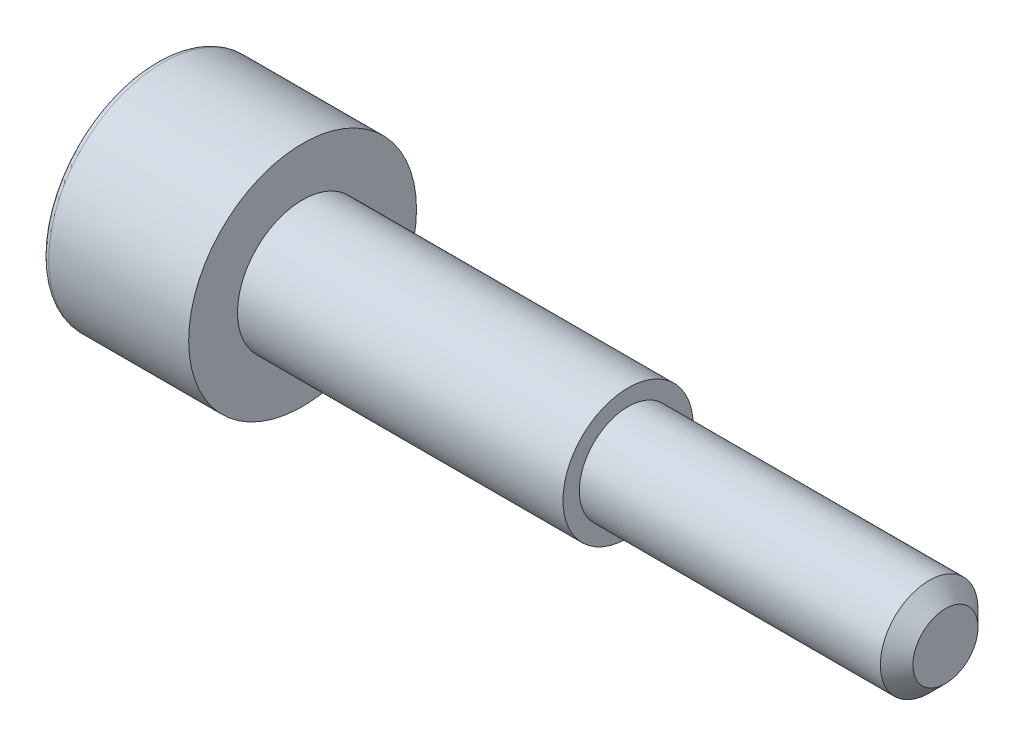
ISO-10303-21;
HEADER;
FILE_DESCRIPTION(('STEP AP214'),'2;1');
FILE_NAME('part.step','',(''),(''),'','','');
FILE_SCHEMA(('AUTOMOTIVE_DESIGN { 1 0 10303 214 1 1 1 1 }'));
ENDSEC;
DATA;
#1=APPLICATION_CONTEXT('core data for automotive mechanical design processes');
#2=APPLICATION_PROTOCOL_DEFINITION('international standard','automotive_design',2000,#1);
#3=PRODUCT_CONTEXT('',#1,'mechanical');
#4=PRODUCT('Part','Part','',(#3));
#5=PRODUCT_RELATED_PRODUCT_CATEGORY('part','',(#4));
#6=PRODUCT_DEFINITION_FORMATION('','',#4);
#7=PRODUCT_DEFINITION_CONTEXT('part definition',#1,'design');
#8=PRODUCT_DEFINITION('design','',#6,#7);
#9=PRODUCT_DEFINITION_SHAPE('','',#8);
#10=(LENGTH_UNIT() NAMED_UNIT(*) SI_UNIT(.MILLI.,.METRE.));
#11=(NAMED_UNIT(*) PLANE_ANGLE_UNIT() SI_UNIT($,.RADIAN.));
#12=(NAMED_UNIT(*) SI_UNIT($,.STERADIAN.) SOLID_ANGLE_UNIT());
#13=UNCERTAINTY_MEASURE_WITH_UNIT(LENGTH_MEASURE(1.E-05),#10,'distance_accuracy_value','');
#14=(GEOMETRIC_REPRESENTATION_CONTEXT(3) GLOBAL_UNCERTAINTY_ASSIGNED_CONTEXT((#13)) GLOBAL_UNIT_ASSIGNED_CONTEXT((#10,
#11,#12)) REPRESENTATION_CONTEXT('',''));
#15=CARTESIAN_POINT('',(0.,0.,0.));
#16=DIRECTION('',(0.,0.,1.));
#17=DIRECTION('',(1.,0.,0.));
#18=AXIS2_PLACEMENT_3D('',#15,#16,#17);
#19=CARTESIAN_POINT('',(0.,0.,0.));
#20=DIRECTION('',(1.,0.,0.));
#21=DIRECTION('',(0.,0.,-1.));
#22=AXIS2_PLACEMENT_3D('',#19,#20,#21);
#23=PLANE('',#22);
#24=CARTESIAN_POINT('',(0.,0.,0.));
#25=DIRECTION('',(1.,0.,0.));
#26=DIRECTION('',(0.,0.,-1.));
#27=AXIS2_PLACEMENT_3D('',#24,#25,#26);
#28=CIRCLE('',#27,3.3);
#29=CARTESIAN_POINT('',(0.,0.,-3.3));
#30=VERTEX_POINT('',#29);
#31=EDGE_CURVE('E11',#30,#30,#28,.F.);
#32=ORIENTED_EDGE('',*,*,#31,.T.);
#33=EDGE_LOOP('',(#32));
#34=FACE_BOUND('',#33,.T.);
#35=DIRECTION('',(0.,0.866025403784439,-0.5));
#36=VECTOR('',#35,1.);
#37=CARTESIAN_POINT('',(0.,-1.5,-0.86602540378444));
#38=LINE('',#37,#36);
#39=CARTESIAN_POINT('',(0.,-1.5,-0.86602540378444));
#40=VERTEX_POINT('',#39);
#41=CARTESIAN_POINT('',(0.,0.,-1.73205080756888));
#42=VERTEX_POINT('',#41);
#43=EDGE_CURVE('E52',#40,#42,#38,.T.);
#44=ORIENTED_EDGE('',*,*,#43,.T.);
#45=DIRECTION('',(0.,0.866025403784438,0.5));
#46=VECTOR('',#45,1.);
#47=CARTESIAN_POINT('',(0.,0.,-1.73205080756888));
#48=LINE('',#47,#46);
#49=CARTESIAN_POINT('',(0.,1.5,-0.866025403784438));
#50=VERTEX_POINT('',#49);
#51=EDGE_CURVE('E111',#42,#50,#48,.T.);
#52=ORIENTED_EDGE('',*,*,#51,.T.);
#53=DIRECTION('',(0.,0.,1.));
#54=VECTOR('',#53,1.);
#55=CARTESIAN_POINT('',(0.,1.5,-0.866025403784438));
#56=LINE('',#55,#54);
#57=CARTESIAN_POINT('',(0.,1.5,0.866025403784439));
#58=VERTEX_POINT('',#57);
#59=EDGE_CURVE('E109',#50,#58,#56,.T.);
#60=ORIENTED_EDGE('',*,*,#59,.T.);
#61=DIRECTION('',(0.,-0.866025403784439,0.5));
#62=VECTOR('',#61,1.);
#63=CARTESIAN_POINT('',(0.,1.5,0.866025403784439));
#64=LINE('',#63,#62);
#65=CARTESIAN_POINT('',(0.,0.,1.73205080756888));
#66=VERTEX_POINT('',#65);
#67=EDGE_CURVE('E88',#58,#66,#64,.T.);
#68=ORIENTED_EDGE('',*,*,#67,.T.);
#69=DIRECTION('',(0.,-0.866025403784438,-0.5));
#70=VECTOR('',#69,1.);
#71=CARTESIAN_POINT('',(0.,0.,1.73205080756888));
#72=LINE('',#71,#70);
#73=CARTESIAN_POINT('',(0.,-1.5,0.866025403784439));
#74=VERTEX_POINT('',#73);
#75=EDGE_CURVE('E99',#66,#74,#72,.T.);
#76=ORIENTED_EDGE('',*,*,#75,.T.);
#77=DIRECTION('',(0.,0.,-1.));
#78=VECTOR('',#77,1.);
#79=CARTESIAN_POINT('',(0.,-1.5,0.866025403784439));
#80=LINE('',#79,#78);
#81=EDGE_CURVE('E105',#74,#40,#80,.T.);
#82=ORIENTED_EDGE('',*,*,#81,.T.);
#83=EDGE_LOOP('',(#44,#52,#60,#68,#76,#82));
#84=FACE_BOUND('',#83,.T.);
#85=ADVANCED_FACE('F37',(#34,#84),#23,.F.);
#86=CARTESIAN_POINT('',(14.5,0.,0.));
#87=DIRECTION('',(1.,0.,0.));
#88=DIRECTION('',(0.,0.,-1.));
#89=AXIS2_PLACEMENT_3D('',#86,#87,#88);
#90=PLANE('',#89);
#91=CARTESIAN_POINT('',(14.5,0.,0.));
#92=DIRECTION('',(1.,0.,0.));
#93=DIRECTION('',(0.,0.,-1.));
#94=AXIS2_PLACEMENT_3D('',#91,#92,#93);
#95=CIRCLE('',#94,2.);
#96=CARTESIAN_POINT('',(14.5,0.,-2.));
#97=VERTEX_POINT('',#96);
#98=EDGE_CURVE('E130',#97,#97,#95,.T.);
#99=ORIENTED_EDGE('',*,*,#98,.T.);
#100=EDGE_LOOP('',(#99));
#101=FACE_BOUND('',#100,.T.);
#102=CARTESIAN_POINT('',(14.5,0.,0.));
#103=DIRECTION('',(1.,0.,0.));
#104=DIRECTION('',(0.,0.,-1.));
#105=AXIS2_PLACEMENT_3D('',#102,#103,#104);
#106=CIRCLE('',#105,1.5);
#107=CARTESIAN_POINT('',(14.5,0.,-1.5));
#108=VERTEX_POINT('',#107);
#109=EDGE_CURVE('E126',#108,#108,#106,.T.);
#110=ORIENTED_EDGE('',*,*,#109,.F.);
#111=EDGE_LOOP('',(#110));
#112=FACE_BOUND('',#111,.T.);
#113=ADVANCED_FACE('F160',(#101,#112),#90,.T.);
#114=CARTESIAN_POINT('',(4.5,0.,0.));
#115=DIRECTION('',(1.,0.,0.));
#116=DIRECTION('',(0.,0.,-1.));
#117=AXIS2_PLACEMENT_3D('',#114,#115,#116);
#118=PLANE('',#117);
#119=CARTESIAN_POINT('',(4.5,0.,0.));
#120=DIRECTION('',(1.,0.,0.));
#121=DIRECTION('',(0.,0.,-1.));
#122=AXIS2_PLACEMENT_3D('',#119,#120,#121);
#123=CIRCLE('',#122,3.5);
#124=CARTESIAN_POINT('',(4.5,0.,-3.5));
#125=VERTEX_POINT('',#124);
#126=EDGE_CURVE('E133',#125,#125,#123,.T.);
#127=ORIENTED_EDGE('',*,*,#126,.T.);
#128=EDGE_LOOP('',(#127));
#129=FACE_BOUND('',#128,.T.);
#130=CARTESIAN_POINT('',(4.5,0.,0.));
#131=DIRECTION('',(1.,0.,0.));
#132=DIRECTION('',(0.,0.,-1.));
#133=AXIS2_PLACEMENT_3D('',#130,#131,#132);
#134=CIRCLE('',#133,2.);
#135=CARTESIAN_POINT('',(4.5,0.,-2.));
#136=VERTEX_POINT('',#135);
#137=EDGE_CURVE('E129',#136,#136,#134,.T.);
#138=ORIENTED_EDGE('',*,*,#137,.F.);
#139=EDGE_LOOP('',(#138));
#140=FACE_BOUND('',#139,.T.);
#141=ADVANCED_FACE('F166',(#129,#140),#118,.T.);
#142=CARTESIAN_POINT('',(4.5,0.,0.));
#143=DIRECTION('',(-1.,0.,0.));
#144=DIRECTION('',(0.,0.,1.));
#145=AXIS2_PLACEMENT_3D('',#142,#143,#144);
#146=CYLINDRICAL_SURFACE('',#145,3.5);
#147=CARTESIAN_POINT('',(0.2,0.,0.));
#148=DIRECTION('',(1.,0.,0.));
#149=DIRECTION('',(0.,0.,-1.));
#150=AXIS2_PLACEMENT_3D('',#147,#148,#149);
#151=CIRCLE('',#150,3.5);
#152=CARTESIAN_POINT('',(0.2,0.,-3.5));
#153=VERTEX_POINT('',#152);
#154=EDGE_CURVE('E45',#153,#153,#151,.T.);
#155=ORIENTED_EDGE('',*,*,#154,.T.);
#156=EDGE_LOOP('',(#155));
#157=FACE_BOUND('',#156,.T.);
#158=ORIENTED_EDGE('',*,*,#126,.F.);
#159=EDGE_LOOP('',(#158));
#160=FACE_BOUND('',#159,.T.);
#161=ADVANCED_FACE('F147',(#157,#160),#146,.T.);
#162=CARTESIAN_POINT('',(14.5,0.,0.));
#163=DIRECTION('',(-1.,0.,0.));
#164=DIRECTION('',(0.,0.,1.));
#165=AXIS2_PLACEMENT_3D('',#162,#163,#164);
#166=CYLINDRICAL_SURFACE('',#165,2.);
#167=ORIENTED_EDGE('',*,*,#98,.F.);
#168=EDGE_LOOP('',(#167));
#169=FACE_BOUND('',#168,.T.);
#170=ORIENTED_EDGE('',*,*,#137,.T.);
#171=EDGE_LOOP('',(#170));
#172=FACE_BOUND('',#171,.T.);
#173=ADVANCED_FACE('F173',(#169,#172),#166,.T.);
#174=CARTESIAN_POINT('',(24.25,0.,0.));
#175=DIRECTION('',(-1.,0.,0.));
#176=DIRECTION('',(0.,0.,1.));
#177=AXIS2_PLACEMENT_3D('',#174,#175,#176);
#178=CYLINDRICAL_SURFACE('',#177,1.5);
#179=CARTESIAN_POINT('',(23.75,0.,0.));
#180=DIRECTION('',(1.,0.,0.));
#181=DIRECTION('',(0.,0.,-1.));
#182=AXIS2_PLACEMENT_3D('',#179,#180,#181);
#183=CIRCLE('',#182,1.5);
#184=CARTESIAN_POINT('',(23.75,0.,-1.5));
#185=VERTEX_POINT('',#184);
#186=EDGE_CURVE('E142',#185,#185,#183,.F.);
#187=ORIENTED_EDGE('',*,*,#186,.T.);
#188=EDGE_LOOP('',(#187));
#189=FACE_BOUND('',#188,.T.);
#190=ORIENTED_EDGE('',*,*,#109,.T.);
#191=EDGE_LOOP('',(#190));
#192=FACE_BOUND('',#191,.T.);
#193=ADVANCED_FACE('F178',(#189,#192),#178,.T.);
#194=CARTESIAN_POINT('',(24.25,0.,0.));
#195=DIRECTION('',(1.,0.,0.));
#196=DIRECTION('',(0.,0.,-1.));
#197=AXIS2_PLACEMENT_3D('',#194,#195,#196);
#198=PLANE('',#197);
#199=CARTESIAN_POINT('',(24.25,0.,0.));
#200=DIRECTION('',(1.,0.,0.));
#201=DIRECTION('',(0.,0.,-1.));
#202=AXIS2_PLACEMENT_3D('',#199,#200,#201);
#203=CIRCLE('',#202,0.999999999999997);
#204=CARTESIAN_POINT('',(24.25,0.,-0.999999999999997));
#205=VERTEX_POINT('',#204);
#206=EDGE_CURVE('E139',#205,#205,#203,.T.);
#207=ORIENTED_EDGE('',*,*,#206,.T.);
#208=EDGE_LOOP('',(#207));
#209=FACE_BOUND('',#208,.T.);
#210=ADVANCED_FACE('F206',(#209),#198,.T.);
#211=CARTESIAN_POINT('',(2.4,-1.5,-0.86602540378444));
#212=DIRECTION('',(0.,0.5,0.866025403784439));
#213=DIRECTION('',(0.,-0.866025403784439,0.5));
#214=AXIS2_PLACEMENT_3D('',#211,#212,#213);
#215=PLANE('',#214);
#216=ORIENTED_EDGE('',*,*,#43,.F.);
#217=DIRECTION('',(-1.,0.,0.));
#218=VECTOR('',#217,1.);
#219=CARTESIAN_POINT('',(2.4,-1.5,-0.86602540378444));
#220=LINE('',#219,#218);
#221=CARTESIAN_POINT('',(2.4,-1.5,-0.86602540378444));
#222=VERTEX_POINT('',#221);
#223=EDGE_CURVE('E117',#222,#40,#220,.T.);
#224=ORIENTED_EDGE('',*,*,#223,.F.);
#225=DIRECTION('',(0.,0.866025403784439,-0.5));
#226=VECTOR('',#225,1.);
#227=CARTESIAN_POINT('',(2.4,-1.5,-0.86602540378444));
#228=LINE('',#227,#226);
#229=CARTESIAN_POINT('',(2.4,0.,-1.73205080756888));
#230=VERTEX_POINT('',#229);
#231=EDGE_CURVE('E116',#222,#230,#228,.T.);
#232=ORIENTED_EDGE('',*,*,#231,.T.);
#233=DIRECTION('',(-1.,0.,0.));
#234=VECTOR('',#233,1.);
#235=CARTESIAN_POINT('',(2.4,0.,-1.73205080756888));
#236=LINE('',#235,#234);
#237=EDGE_CURVE('E124',#230,#42,#236,.T.);
#238=ORIENTED_EDGE('',*,*,#237,.T.);
#239=EDGE_LOOP('',(#216,#224,#232,#238));
#240=FACE_BOUND('',#239,.T.);
#241=ADVANCED_FACE('F200',(#240),#215,.T.);
#242=CARTESIAN_POINT('',(2.4,0.,-1.73205080756888));
#243=DIRECTION('',(0.,-0.5,0.866025403784438));
#244=DIRECTION('',(0.,-0.866025403784439,-0.5));
#245=AXIS2_PLACEMENT_3D('',#242,#243,#244);
#246=PLANE('',#245);
#247=ORIENTED_EDGE('',*,*,#51,.F.);
#248=ORIENTED_EDGE('',*,*,#237,.F.);
#249=DIRECTION('',(0.,0.866025403784438,0.5));
#250=VECTOR('',#249,1.);
#251=CARTESIAN_POINT('',(2.4,0.,-1.73205080756888));
#252=LINE('',#251,#250);
#253=CARTESIAN_POINT('',(2.4,1.5,-0.866025403784438));
#254=VERTEX_POINT('',#253);
#255=EDGE_CURVE('E367',#230,#254,#252,.T.);
#256=ORIENTED_EDGE('',*,*,#255,.T.);
#257=DIRECTION('',(-1.,0.,0.));
#258=VECTOR('',#257,1.);
#259=CARTESIAN_POINT('',(2.4,1.5,-0.866025403784438));
#260=LINE('',#259,#258);
#261=EDGE_CURVE('E122',#254,#50,#260,.T.);
#262=ORIENTED_EDGE('',*,*,#261,.T.);
#263=EDGE_LOOP('',(#247,#248,#256,#262));
#264=FACE_BOUND('',#263,.T.);
#265=ADVANCED_FACE('F205',(#264),#246,.T.);
#266=CARTESIAN_POINT('',(2.4,1.5,-0.866025403784438));
#267=DIRECTION('',(0.,-1.,0.));
#268=DIRECTION('',(0.,0.,-1.));
#269=AXIS2_PLACEMENT_3D('',#266,#267,#268);
#270=PLANE('',#269);
#271=ORIENTED_EDGE('',*,*,#59,.F.);
#272=ORIENTED_EDGE('',*,*,#261,.F.);
#273=DIRECTION('',(0.,0.,1.));
#274=VECTOR('',#273,1.);
#275=CARTESIAN_POINT('',(2.4,1.5,-0.866025403784438));
#276=LINE('',#275,#274);
#277=CARTESIAN_POINT('',(2.4,1.5,0.866025403784439));
#278=VERTEX_POINT('',#277);
#279=EDGE_CURVE('E61',#254,#278,#276,.T.);
#280=ORIENTED_EDGE('',*,*,#279,.T.);
#281=DIRECTION('',(-1.,0.,0.));
#282=VECTOR('',#281,1.);
#283=CARTESIAN_POINT('',(2.4,1.5,0.866025403784439));
#284=LINE('',#283,#282);
#285=EDGE_CURVE('E95',#278,#58,#284,.T.);
#286=ORIENTED_EDGE('',*,*,#285,.T.);
#287=EDGE_LOOP('',(#271,#272,#280,#286));
#288=FACE_BOUND('',#287,.T.);
#289=ADVANCED_FACE('F217',(#288),#270,.T.);
#290=CARTESIAN_POINT('',(2.4,1.5,0.866025403784439));
#291=DIRECTION('',(0.,-0.5,-0.866025403784439));
#292=DIRECTION('',(0.,0.866025403784439,-0.5));
#293=AXIS2_PLACEMENT_3D('',#290,#291,#292);
#294=PLANE('',#293);
#295=ORIENTED_EDGE('',*,*,#67,.F.);
#296=ORIENTED_EDGE('',*,*,#285,.F.);
#297=DIRECTION('',(0.,-0.866025403784439,0.5));
#298=VECTOR('',#297,1.);
#299=CARTESIAN_POINT('',(2.4,1.5,0.866025403784439));
#300=LINE('',#299,#298);
#301=CARTESIAN_POINT('',(2.4,0.,1.73205080756888));
#302=VERTEX_POINT('',#301);
#303=EDGE_CURVE('E92',#278,#302,#300,.T.);
#304=ORIENTED_EDGE('',*,*,#303,.T.);
#305=DIRECTION('',(-1.,0.,0.));
#306=VECTOR('',#305,1.);
#307=CARTESIAN_POINT('',(2.4,0.,1.73205080756888));
#308=LINE('',#307,#306);
#309=EDGE_CURVE('E83',#302,#66,#308,.T.);
#310=ORIENTED_EDGE('',*,*,#309,.T.);
#311=EDGE_LOOP('',(#295,#296,#304,#310));
#312=FACE_BOUND('',#311,.T.);
#313=ADVANCED_FACE('F85',(#312),#294,.T.);
#314=CARTESIAN_POINT('',(2.4,0.,1.73205080756888));
#315=DIRECTION('',(0.,0.5,-0.866025403784438));
#316=DIRECTION('',(0.,0.866025403784438,0.5));
#317=AXIS2_PLACEMENT_3D('',#314,#315,#316);
#318=PLANE('',#317);
#319=ORIENTED_EDGE('',*,*,#75,.F.);
#320=ORIENTED_EDGE('',*,*,#309,.F.);
#321=DIRECTION('',(0.,-0.866025403784438,-0.5));
#322=VECTOR('',#321,1.);
#323=CARTESIAN_POINT('',(2.4,0.,1.73205080756888));
#324=LINE('',#323,#322);
#325=CARTESIAN_POINT('',(2.4,-1.5,0.866025403784439));
#326=VERTEX_POINT('',#325);
#327=EDGE_CURVE('E386',#302,#326,#324,.T.);
#328=ORIENTED_EDGE('',*,*,#327,.T.);
#329=DIRECTION('',(-1.,0.,0.));
#330=VECTOR('',#329,1.);
#331=CARTESIAN_POINT('',(2.4,-1.5,0.866025403784439));
#332=LINE('',#331,#330);
#333=EDGE_CURVE('E96',#326,#74,#332,.T.);
#334=ORIENTED_EDGE('',*,*,#333,.T.);
#335=EDGE_LOOP('',(#319,#320,#328,#334));
#336=FACE_BOUND('',#335,.T.);
#337=ADVANCED_FACE('F100',(#336),#318,.T.);
#338=CARTESIAN_POINT('',(2.4,-1.5,0.866025403784439));
#339=DIRECTION('',(0.,1.,0.));
#340=DIRECTION('',(0.,0.,1.));
#341=AXIS2_PLACEMENT_3D('',#338,#339,#340);
#342=PLANE('',#341);
#343=ORIENTED_EDGE('',*,*,#81,.F.);
#344=ORIENTED_EDGE('',*,*,#333,.F.);
#345=DIRECTION('',(0.,0.,-1.));
#346=VECTOR('',#345,1.);
#347=CARTESIAN_POINT('',(2.4,-1.5,0.866025403784439));
#348=LINE('',#347,#346);
#349=EDGE_CURVE('E119',#326,#222,#348,.T.);
#350=ORIENTED_EDGE('',*,*,#349,.T.);
#351=ORIENTED_EDGE('',*,*,#223,.T.);
#352=EDGE_LOOP('',(#343,#344,#350,#351));
#353=FACE_BOUND('',#352,.T.);
#354=ADVANCED_FACE('F244',(#353),#342,.T.);
#355=CARTESIAN_POINT('',(2.4,1.5,0.866025403784439));
#356=DIRECTION('',(0.86602540378444,0.249999999999999,0.433012701892218));
#357=DIRECTION('',(0.447213595499956,0.,-0.894427190999917));
#358=AXIS2_PLACEMENT_3D('',#355,#356,#357);
#359=PLANE('',#358);
#360=ORIENTED_EDGE('',*,*,#303,.F.);
#361=DIRECTION('',(-0.447213595499956,0.774596669241484,0.447213595499958));
#362=VECTOR('',#361,1.);
#363=CARTESIAN_POINT('',(2.4,1.5,0.866025403784439));
#364=LINE('',#363,#362);
#365=CARTESIAN_POINT('',(3.26602540378443,0.,0.));
#366=VERTEX_POINT('',#365);
#367=EDGE_CURVE('E398',#366,#278,#364,.T.);
#368=ORIENTED_EDGE('',*,*,#367,.F.);
#369=DIRECTION('',(-0.447213595499956,0.,0.894427190999917));
#370=VECTOR('',#369,1.);
#371=CARTESIAN_POINT('',(2.4,0.,1.73205080756888));
#372=LINE('',#371,#370);
#373=EDGE_CURVE('E382',#366,#302,#372,.T.);
#374=ORIENTED_EDGE('',*,*,#373,.T.);
#375=EDGE_LOOP('',(#360,#368,#374));
#376=FACE_BOUND('',#375,.T.);
#377=ADVANCED_FACE('F253',(#376),#359,.F.);
#378=CARTESIAN_POINT('',(2.4,0.,1.73205080756888));
#379=DIRECTION('',(0.86602540378444,-0.249999999999999,0.433012701892217));
#380=DIRECTION('',(0.447213595499956,0.,-0.894427190999917));
#381=AXIS2_PLACEMENT_3D('',#378,#379,#380);
#382=PLANE('',#381);
#383=ORIENTED_EDGE('',*,*,#327,.F.);
#384=ORIENTED_EDGE('',*,*,#373,.F.);
#385=DIRECTION('',(-0.447213595499956,-0.774596669241484,0.447213595499958));
#386=VECTOR('',#385,1.);
#387=CARTESIAN_POINT('',(2.4,-1.5,0.866025403784439));
#388=LINE('',#387,#386);
#389=EDGE_CURVE('E390',#366,#326,#388,.T.);
#390=ORIENTED_EDGE('',*,*,#389,.T.);
#391=EDGE_LOOP('',(#383,#384,#390));
#392=FACE_BOUND('',#391,.T.);
#393=ADVANCED_FACE('F263',(#392),#382,.F.);
#394=CARTESIAN_POINT('',(2.4,-1.5,0.866025403784439));
#395=DIRECTION('',(0.86602540378444,-0.499999999999998,0.));
#396=DIRECTION('',(0.499999999999998,0.86602540378444,0.));
#397=AXIS2_PLACEMENT_3D('',#394,#395,#396);
#398=PLANE('',#397);
#399=ORIENTED_EDGE('',*,*,#349,.F.);
#400=ORIENTED_EDGE('',*,*,#389,.F.);
#401=DIRECTION('',(-0.447213595499956,-0.774596669241484,-0.447213595499958));
#402=VECTOR('',#401,1.);
#403=CARTESIAN_POINT('',(2.4,-1.5,-0.86602540378444));
#404=LINE('',#403,#402);
#405=EDGE_CURVE('E393',#366,#222,#404,.T.);
#406=ORIENTED_EDGE('',*,*,#405,.T.);
#407=EDGE_LOOP('',(#399,#400,#406));
#408=FACE_BOUND('',#407,.T.);
#409=ADVANCED_FACE('F273',(#408),#398,.F.);
#410=CARTESIAN_POINT('',(2.4,-1.5,-0.86602540378444));
#411=DIRECTION('',(0.86602540378444,-0.249999999999999,-0.433012701892218));
#412=DIRECTION('',(-0.447213595499956,0.,-0.894427190999917));
#413=AXIS2_PLACEMENT_3D('',#410,#411,#412);
#414=PLANE('',#413);
#415=ORIENTED_EDGE('',*,*,#231,.F.);
#416=ORIENTED_EDGE('',*,*,#405,.F.);
#417=DIRECTION('',(-0.447213595499956,0.,-0.894427190999917));
#418=VECTOR('',#417,1.);
#419=CARTESIAN_POINT('',(2.4,0.,-1.73205080756888));
#420=LINE('',#419,#418);
#421=EDGE_CURVE('E370',#366,#230,#420,.T.);
#422=ORIENTED_EDGE('',*,*,#421,.T.);
#423=EDGE_LOOP('',(#415,#416,#422));
#424=FACE_BOUND('',#423,.T.);
#425=ADVANCED_FACE('F283',(#424),#414,.F.);
#426=CARTESIAN_POINT('',(2.4,0.,-1.73205080756888));
#427=DIRECTION('',(0.86602540378444,0.249999999999999,-0.433012701892217));
#428=DIRECTION('',(-0.447213595499956,0.,-0.894427190999917));
#429=AXIS2_PLACEMENT_3D('',#426,#427,#428);
#430=PLANE('',#429);
#431=ORIENTED_EDGE('',*,*,#255,.F.);
#432=ORIENTED_EDGE('',*,*,#421,.F.);
#433=DIRECTION('',(-0.447213595499956,0.774596669241484,-0.447213595499958));
#434=VECTOR('',#433,1.);
#435=CARTESIAN_POINT('',(2.4,1.5,-0.866025403784438));
#436=LINE('',#435,#434);
#437=EDGE_CURVE('E371',#366,#254,#436,.T.);
#438=ORIENTED_EDGE('',*,*,#437,.T.);
#439=EDGE_LOOP('',(#431,#432,#438));
#440=FACE_BOUND('',#439,.T.);
#441=ADVANCED_FACE('F293',(#440),#430,.F.);
#442=CARTESIAN_POINT('',(2.4,1.5,-0.866025403784438));
#443=DIRECTION('',(0.86602540378444,0.499999999999998,0.));
#444=DIRECTION('',(-0.499999999999998,0.86602540378444,0.));
#445=AXIS2_PLACEMENT_3D('',#442,#443,#444);
#446=PLANE('',#445);
#447=ORIENTED_EDGE('',*,*,#279,.F.);
#448=ORIENTED_EDGE('',*,*,#437,.F.);
#449=ORIENTED_EDGE('',*,*,#367,.T.);
#450=EDGE_LOOP('',(#447,#448,#449));
#451=FACE_BOUND('',#450,.T.);
#452=ADVANCED_FACE('F156',(#451),#446,.F.);
#453=CARTESIAN_POINT('',(24.25,0.,0.));
#454=DIRECTION('',(-1.,0.,0.));
#455=DIRECTION('',(0.,0.,1.));
#456=AXIS2_PLACEMENT_3D('',#453,#454,#455);
#457=CONICAL_SURFACE('',#456,0.999999999999997,0.785398163397447);
#458=ORIENTED_EDGE('',*,*,#186,.F.);
#459=EDGE_LOOP('',(#458));
#460=FACE_BOUND('',#459,.T.);
#461=ORIENTED_EDGE('',*,*,#206,.F.);
#462=EDGE_LOOP('',(#461));
#463=FACE_BOUND('',#462,.T.);
#464=ADVANCED_FACE('F151',(#460,#463),#457,.T.);
#465=CARTESIAN_POINT('',(0.2,0.,0.));
#466=DIRECTION('',(1.,0.,0.));
#467=DIRECTION('',(0.,0.,-1.));
#468=AXIS2_PLACEMENT_3D('',#465,#466,#467);
#469=TOROIDAL_SURFACE('',#468,3.3,0.2);
#470=ORIENTED_EDGE('',*,*,#31,.F.);
#471=EDGE_LOOP('',(#470));
#472=FACE_BOUND('',#471,.T.);
#473=ORIENTED_EDGE('',*,*,#154,.F.);
#474=EDGE_LOOP('',(#473));
#475=FACE_BOUND('',#474,.T.);
#476=ADVANCED_FACE('F39',(#472,#475),#469,.T.);
#477=CLOSED_SHELL('',(#85,#113,#141,#161,#173,#193,#210,#241,#265,#289,#313,#337,#354,#377,#393,
#409,#425,#441,#452,#464,#476));
#478=MANIFOLD_SOLID_BREP('B2',#477);
#479=ADVANCED_BREP_SHAPE_REPRESENTATION('',(#18,#478),#14);
#480=SHAPE_DEFINITION_REPRESENTATION(#9,#479);
ENDSEC;
END-ISO-10303-21;
